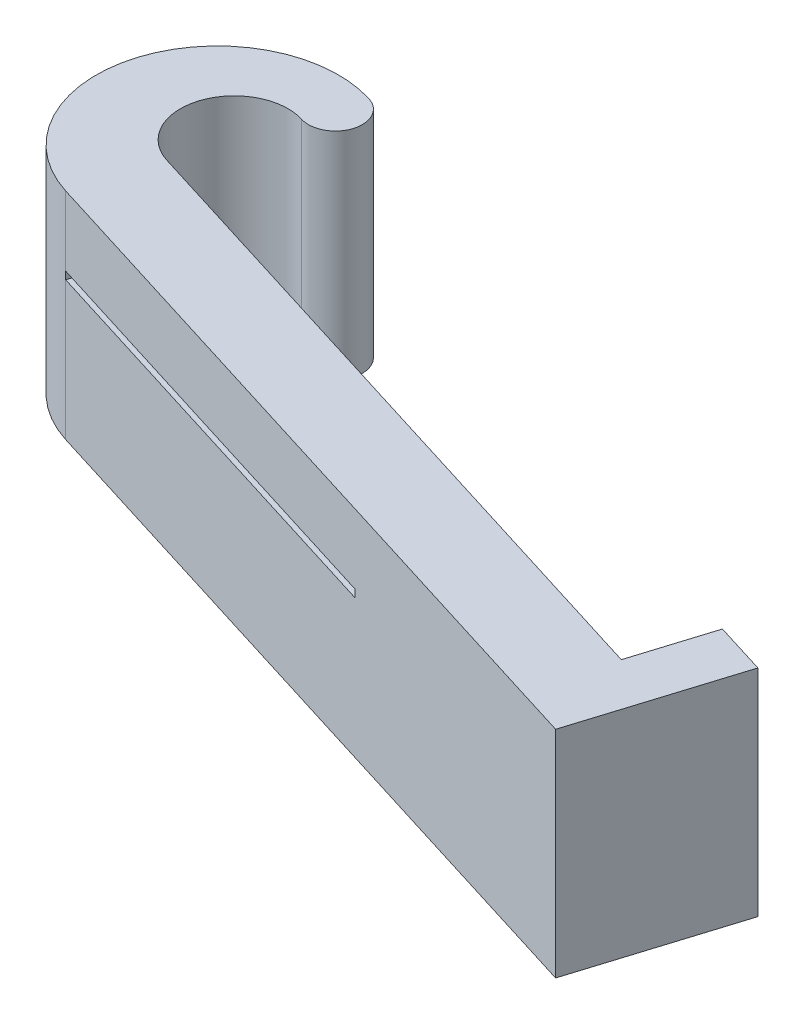
ISO-10303-21;
HEADER;
FILE_DESCRIPTION(('STEP AP214'),'2;1');
FILE_NAME('part.step','',(''),(''),'','','');
FILE_SCHEMA(('AUTOMOTIVE_DESIGN { 1 0 10303 214 1 1 1 1 }'));
ENDSEC;
DATA;
#1=APPLICATION_CONTEXT('core data for automotive mechanical design processes');
#2=APPLICATION_PROTOCOL_DEFINITION('international standard','automotive_design',2000,#1);
#3=PRODUCT_CONTEXT('',#1,'mechanical');
#4=PRODUCT('Part','Part','',(#3));
#5=PRODUCT_RELATED_PRODUCT_CATEGORY('part','',(#4));
#6=PRODUCT_DEFINITION_FORMATION('','',#4);
#7=PRODUCT_DEFINITION_CONTEXT('part definition',#1,'design');
#8=PRODUCT_DEFINITION('design','',#6,#7);
#9=PRODUCT_DEFINITION_SHAPE('','',#8);
#10=(LENGTH_UNIT() NAMED_UNIT(*) SI_UNIT(.MILLI.,.METRE.));
#11=(NAMED_UNIT(*) PLANE_ANGLE_UNIT() SI_UNIT($,.RADIAN.));
#12=(NAMED_UNIT(*) SI_UNIT($,.STERADIAN.) SOLID_ANGLE_UNIT());
#13=UNCERTAINTY_MEASURE_WITH_UNIT(LENGTH_MEASURE(1.E-05),#10,'distance_accuracy_value','');
#14=(GEOMETRIC_REPRESENTATION_CONTEXT(3) GLOBAL_UNCERTAINTY_ASSIGNED_CONTEXT((#13)) GLOBAL_UNIT_ASSIGNED_CONTEXT((#10,
#11,#12)) REPRESENTATION_CONTEXT('',''));
#15=CARTESIAN_POINT('',(0.,0.,0.));
#16=DIRECTION('',(0.,0.,1.));
#17=DIRECTION('',(1.,0.,0.));
#18=AXIS2_PLACEMENT_3D('',#15,#16,#17);
#19=CARTESIAN_POINT('',(-516.187462201425,243.897716301545,44.4627981969084));
#20=DIRECTION('',(-0.954849592597847,0.,-0.297089642222218));
#21=DIRECTION('',(-0.297089642222218,0.,0.954849592597847));
#22=AXIS2_PLACEMENT_3D('',#19,#20,#21);
#23=PLANE('',#22);
#24=DIRECTION('',(0.297089642222218,0.,-0.954849592597847));
#25=VECTOR('',#24,1.);
#26=CARTESIAN_POINT('',(-516.187462201425,17.3432007179993,44.4627981969084));
#27=LINE('',#26,#25);
#28=CARTESIAN_POINT('',(-527.506577570092,17.3432007179993,80.8425676748863));
#29=VERTEX_POINT('',#28);
#30=CARTESIAN_POINT('',(-516.187462201425,17.3432007179993,44.4627981969084));
#31=VERTEX_POINT('',#30);
#32=EDGE_CURVE('E210',#29,#31,#27,.T.);
#33=ORIENTED_EDGE('',*,*,#32,.F.);
#34=DIRECTION('',(0.,-1.,0.));
#35=VECTOR('',#34,1.);
#36=CARTESIAN_POINT('',(-527.506577570092,243.897716301545,80.8425676748863));
#37=LINE('',#36,#35);
#38=CARTESIAN_POINT('',(-527.506577570092,-33.4567992820007,80.8425676748863));
#39=VERTEX_POINT('',#38);
#40=EDGE_CURVE('E39',#29,#39,#37,.T.);
#41=ORIENTED_EDGE('',*,*,#40,.T.);
#42=DIRECTION('',(0.297089642222218,0.,-0.954849592597847));
#43=VECTOR('',#42,1.);
#44=CARTESIAN_POINT('',(-516.187462201425,-33.4567992820007,44.4627981969084));
#45=LINE('',#44,#43);
#46=CARTESIAN_POINT('',(-516.187462201425,-33.4567992820007,44.4627981969084));
#47=VERTEX_POINT('',#46);
#48=EDGE_CURVE('E193',#39,#47,#45,.T.);
#49=ORIENTED_EDGE('',*,*,#48,.T.);
#50=DIRECTION('',(0.,-1.,0.));
#51=VECTOR('',#50,1.);
#52=CARTESIAN_POINT('',(-516.187462201425,243.897716301545,44.4627981969084));
#53=LINE('',#52,#51);
#54=EDGE_CURVE('E192',#31,#47,#53,.T.);
#55=ORIENTED_EDGE('',*,*,#54,.F.);
#56=EDGE_LOOP('',(#33,#41,#49,#55));
#57=FACE_BOUND('',#56,.T.);
#58=ADVANCED_FACE('F35',(#57),#23,.F.);
#59=CARTESIAN_POINT('',(-528.314052027418,243.897716301545,40.6897597406862));
#60=DIRECTION('',(-0.297089642222217,0.,0.954849592597847));
#61=DIRECTION('',(0.954849592597848,0.,0.297089642222217));
#62=AXIS2_PLACEMENT_3D('',#59,#60,#61);
#63=PLANE('',#62);
#64=DIRECTION('',(-0.954849592597848,0.,-0.297089642222217));
#65=VECTOR('',#64,1.);
#66=CARTESIAN_POINT('',(-528.314052027418,17.3432007179993,40.6897597406862));
#67=LINE('',#66,#65);
#68=CARTESIAN_POINT('',(-528.314052027418,17.3432007179993,40.6897597406862));
#69=VERTEX_POINT('',#68);
#70=EDGE_CURVE('E207',#31,#69,#67,.T.);
#71=ORIENTED_EDGE('',*,*,#70,.F.);
#72=ORIENTED_EDGE('',*,*,#54,.T.);
#73=DIRECTION('',(-0.954849592597847,0.,-0.297089642222217));
#74=VECTOR('',#73,1.);
#75=CARTESIAN_POINT('',(-528.314052027418,-33.4567992820007,40.6897597406862));
#76=LINE('',#75,#74);
#77=CARTESIAN_POINT('',(-528.314052027418,-33.4567992820007,40.6897597406862));
#78=VERTEX_POINT('',#77);
#79=EDGE_CURVE('E189',#47,#78,#76,.T.);
#80=ORIENTED_EDGE('',*,*,#79,.T.);
#81=DIRECTION('',(0.,-1.,0.));
#82=VECTOR('',#81,1.);
#83=CARTESIAN_POINT('',(-528.314052027418,243.897716301545,40.6897597406862));
#84=LINE('',#83,#82);
#85=EDGE_CURVE('E188',#69,#78,#84,.T.);
#86=ORIENTED_EDGE('',*,*,#85,.F.);
#87=EDGE_LOOP('',(#71,#72,#80,#86));
#88=FACE_BOUND('',#87,.T.);
#89=ADVANCED_FACE('F254',(#88),#63,.F.);
#90=CARTESIAN_POINT('',(-533.973609711751,243.897716301545,58.8796444796753));
#91=DIRECTION('',(0.95484959259785,0.,0.297089642222211));
#92=DIRECTION('',(0.297089642222211,0.,-0.95484959259785));
#93=AXIS2_PLACEMENT_3D('',#90,#91,#92);
#94=PLANE('',#93);
#95=DIRECTION('',(-0.297089642222211,0.,0.95484959259785));
#96=VECTOR('',#95,1.);
#97=CARTESIAN_POINT('',(-533.973609711751,17.3432007179993,58.8796444796753));
#98=LINE('',#97,#96);
#99=CARTESIAN_POINT('',(-533.973609711751,17.3432007179993,58.8796444796753));
#100=VERTEX_POINT('',#99);
#101=EDGE_CURVE('E204',#69,#100,#98,.T.);
#102=ORIENTED_EDGE('',*,*,#101,.F.);
#103=ORIENTED_EDGE('',*,*,#85,.T.);
#104=DIRECTION('',(-0.297089642222211,0.,0.954849592597849));
#105=VECTOR('',#104,1.);
#106=CARTESIAN_POINT('',(-533.973609711751,-33.4567992820007,58.8796444796753));
#107=LINE('',#106,#105);
#108=CARTESIAN_POINT('',(-533.973609711751,-33.4567992820007,58.8796444796753));
#109=VERTEX_POINT('',#108);
#110=EDGE_CURVE('E185',#78,#109,#107,.T.);
#111=ORIENTED_EDGE('',*,*,#110,.T.);
#112=DIRECTION('',(0.,-1.,0.));
#113=VECTOR('',#112,1.);
#114=CARTESIAN_POINT('',(-533.973609711751,243.897716301545,58.8796444796753));
#115=LINE('',#114,#113);
#116=EDGE_CURVE('E184',#100,#109,#115,.T.);
#117=ORIENTED_EDGE('',*,*,#116,.F.);
#118=EDGE_LOOP('',(#102,#103,#111,#117));
#119=FACE_BOUND('',#118,.T.);
#120=ADVANCED_FACE('F251',(#119),#94,.F.);
#121=CARTESIAN_POINT('',(-689.573038456222,243.897716301545,10.4668065059927));
#122=DIRECTION('',(-0.297089642222218,0.,0.954849592597847));
#123=DIRECTION('',(0.954849592597847,0.,0.297089642222218));
#124=AXIS2_PLACEMENT_3D('',#121,#122,#123);
#125=PLANE('',#124);
#126=DIRECTION('',(-0.954849592597847,0.,-0.297089642222218));
#127=VECTOR('',#126,1.);
#128=CARTESIAN_POINT('',(-689.573038456222,17.3432007179993,10.4668065059927));
#129=LINE('',#128,#127);
#130=CARTESIAN_POINT('',(-689.573038456222,17.3432007179993,10.4668065059927));
#131=VERTEX_POINT('',#130);
#132=EDGE_CURVE('E201',#100,#131,#129,.T.);
#133=ORIENTED_EDGE('',*,*,#132,.F.);
#134=ORIENTED_EDGE('',*,*,#116,.T.);
#135=DIRECTION('',(-0.954849592597847,0.,-0.297089642222218));
#136=VECTOR('',#135,1.);
#137=CARTESIAN_POINT('',(-689.573038456222,-33.4567992820007,10.4668065059927));
#138=LINE('',#137,#136);
#139=CARTESIAN_POINT('',(-689.573038456222,-33.4567992820007,10.4668065059927));
#140=VERTEX_POINT('',#139);
#141=EDGE_CURVE('E181',#109,#140,#138,.T.);
#142=ORIENTED_EDGE('',*,*,#141,.T.);
#143=DIRECTION('',(0.,-1.,0.));
#144=VECTOR('',#143,1.);
#145=CARTESIAN_POINT('',(-689.573038456222,243.897716301545,10.4668065059927));
#146=LINE('',#145,#144);
#147=EDGE_CURVE('E180',#131,#140,#146,.T.);
#148=ORIENTED_EDGE('',*,*,#147,.F.);
#149=EDGE_LOOP('',(#133,#134,#142,#148));
#150=FACE_BOUND('',#149,.T.);
#151=ADVANCED_FACE('F248',(#150),#125,.F.);
#152=CARTESIAN_POINT('',(-685.8,243.897716301545,-1.65978332));
#153=DIRECTION('',(0.,-1.,0.));
#154=DIRECTION('',(0.,0.,-1.));
#155=AXIS2_PLACEMENT_3D('',#152,#153,#154);
#156=CYLINDRICAL_SURFACE('',#155,12.7);
#157=CARTESIAN_POINT('',(-685.8,17.3432007179993,-1.65978332));
#158=DIRECTION('',(0.,1.,0.));
#159=DIRECTION('',(0.,0.,1.));
#160=AXIS2_PLACEMENT_3D('',#157,#158,#159);
#161=CIRCLE('',#160,12.7);
#162=CARTESIAN_POINT('',(-682.026961543778,17.3432007179993,-13.7863731459927));
#163=VERTEX_POINT('',#162);
#164=EDGE_CURVE('E198',#131,#163,#161,.F.);
#165=ORIENTED_EDGE('',*,*,#164,.F.);
#166=ORIENTED_EDGE('',*,*,#147,.T.);
#167=CARTESIAN_POINT('',(-685.8,-33.4567992820007,-1.65978332));
#168=DIRECTION('',(0.,-1.,0.));
#169=DIRECTION('',(0.,0.,-1.));
#170=AXIS2_PLACEMENT_3D('',#167,#168,#169);
#171=CIRCLE('',#170,12.7);
#172=CARTESIAN_POINT('',(-682.026961543778,-33.4567992820007,-13.7863731459927));
#173=VERTEX_POINT('',#172);
#174=EDGE_CURVE('E177',#140,#173,#171,.T.);
#175=ORIENTED_EDGE('',*,*,#174,.T.);
#176=DIRECTION('',(0.,-1.,0.));
#177=VECTOR('',#176,1.);
#178=CARTESIAN_POINT('',(-682.026961543778,243.897716301545,-13.7863731459927));
#179=LINE('',#178,#177);
#180=EDGE_CURVE('E176',#163,#173,#179,.T.);
#181=ORIENTED_EDGE('',*,*,#180,.F.);
#182=EDGE_LOOP('',(#165,#166,#175,#181));
#183=FACE_BOUND('',#182,.T.);
#184=ADVANCED_FACE('F245',(#183),#156,.F.);
#185=CARTESIAN_POINT('',(-680.140442315667,243.897716301545,-19.849668058989));
#186=DIRECTION('',(0.,-1.,0.));
#187=DIRECTION('',(0.,0.,-1.));
#188=AXIS2_PLACEMENT_3D('',#185,#186,#187);
#189=CYLINDRICAL_SURFACE('',#188,6.35);
#190=CARTESIAN_POINT('',(-680.140442315667,17.3432007179993,-19.849668058989));
#191=DIRECTION('',(0.,1.,0.));
#192=DIRECTION('',(0.,0.,1.));
#193=AXIS2_PLACEMENT_3D('',#190,#191,#192);
#194=CIRCLE('',#193,6.35);
#195=CARTESIAN_POINT('',(-678.253923087556,17.3432007179993,-25.9129629719854));
#196=VERTEX_POINT('',#195);
#197=EDGE_CURVE('E44',#163,#196,#194,.T.);
#198=ORIENTED_EDGE('',*,*,#197,.F.);
#199=ORIENTED_EDGE('',*,*,#180,.T.);
#200=CARTESIAN_POINT('',(-680.140442315667,-33.4567992820007,-19.849668058989));
#201=DIRECTION('',(0.,1.,0.));
#202=DIRECTION('',(0.,0.,-1.));
#203=AXIS2_PLACEMENT_3D('',#200,#201,#202);
#204=CIRCLE('',#203,6.35);
#205=CARTESIAN_POINT('',(-678.253923087556,-33.4567992820007,-25.9129629719854));
#206=VERTEX_POINT('',#205);
#207=EDGE_CURVE('E173',#173,#206,#204,.T.);
#208=ORIENTED_EDGE('',*,*,#207,.T.);
#209=DIRECTION('',(0.,-1.,0.));
#210=VECTOR('',#209,1.);
#211=CARTESIAN_POINT('',(-678.253923087556,243.897716301545,-25.9129629719854));
#212=LINE('',#211,#210);
#213=EDGE_CURVE('E172',#196,#206,#212,.T.);
#214=ORIENTED_EDGE('',*,*,#213,.F.);
#215=EDGE_LOOP('',(#198,#199,#208,#214));
#216=FACE_BOUND('',#215,.T.);
#217=ADVANCED_FACE('F240',(#216),#189,.T.);
#218=CARTESIAN_POINT('',(-686.743259614056,243.897716301545,1.37186413649816));
#219=DIRECTION('',(0.,-1.,0.));
#220=DIRECTION('',(0.,0.,-1.));
#221=AXIS2_PLACEMENT_3D('',#218,#219,#220);
#222=CYLINDRICAL_SURFACE('',#221,28.575);
#223=CARTESIAN_POINT('',(-686.743259614056,17.3432007179993,1.37186413649816));
#224=DIRECTION('',(0.,1.,0.));
#225=DIRECTION('',(0.,0.,1.));
#226=AXIS2_PLACEMENT_3D('',#223,#224,#225);
#227=CIRCLE('',#226,28.575);
#228=CARTESIAN_POINT('',(-695.232596140555,17.3432007179993,28.6566912449817));
#229=VERTEX_POINT('',#228);
#230=EDGE_CURVE('E11',#196,#229,#227,.T.);
#231=ORIENTED_EDGE('',*,*,#230,.F.);
#232=ORIENTED_EDGE('',*,*,#213,.T.);
#233=CARTESIAN_POINT('',(-686.743259614056,-33.4567992820007,1.37186413649816));
#234=DIRECTION('',(0.,1.,0.));
#235=DIRECTION('',(0.,0.,-1.));
#236=AXIS2_PLACEMENT_3D('',#233,#234,#235);
#237=CIRCLE('',#236,28.575);
#238=CARTESIAN_POINT('',(-695.232596140555,-33.4567992820007,28.6566912449817));
#239=VERTEX_POINT('',#238);
#240=EDGE_CURVE('E168',#206,#239,#237,.T.);
#241=ORIENTED_EDGE('',*,*,#240,.T.);
#242=DIRECTION('',(0.,-1.,0.));
#243=VECTOR('',#242,1.);
#244=CARTESIAN_POINT('',(-695.232596140555,243.897716301545,28.6566912449817));
#245=LINE('',#244,#243);
#246=CARTESIAN_POINT('',(-695.232596140555,-0.819404421791042,28.6566912449817));
#247=VERTEX_POINT('',#246);
#248=EDGE_CURVE('E171',#247,#239,#245,.T.);
#249=ORIENTED_EDGE('',*,*,#248,.F.);
#250=DIRECTION('',(0.,-1.,0.));
#251=VECTOR('',#250,1.);
#252=CARTESIAN_POINT('',(-695.232596140555,0.961805857789599,28.6566912449818));
#253=LINE('',#252,#251);
#254=CARTESIAN_POINT('',(-695.232596140555,0.961805857789599,28.6566912449818));
#255=VERTEX_POINT('',#254);
#256=EDGE_CURVE('E52',#255,#247,#253,.T.);
#257=ORIENTED_EDGE('',*,*,#256,.F.);
#258=EDGE_CURVE('E167',#229,#255,#245,.T.);
#259=ORIENTED_EDGE('',*,*,#258,.F.);
#260=EDGE_LOOP('',(#231,#232,#241,#249,#257,#259));
#261=FACE_BOUND('',#260,.T.);
#262=ADVANCED_FACE('F229',(#261),#222,.T.);
#263=CARTESIAN_POINT('',(-527.506577570092,243.897716301545,80.8425676748863));
#264=DIRECTION('',(0.297089642222217,0.,-0.954849592597848));
#265=DIRECTION('',(-0.954849592597848,0.,-0.297089642222217));
#266=AXIS2_PLACEMENT_3D('',#263,#264,#265);
#267=PLANE('',#266);
#268=ORIENTED_EDGE('',*,*,#258,.T.);
#269=DIRECTION('',(-0.954849592597847,0.,-0.297089642222217));
#270=VECTOR('',#269,1.);
#271=CARTESIAN_POINT('',(-695.232596140555,0.961805857789599,28.6566912449818));
#272=LINE('',#271,#270);
#273=CARTESIAN_POINT('',(-596.12540192545,0.961805857789599,59.4926690777903));
#274=VERTEX_POINT('',#273);
#275=EDGE_CURVE('E146',#274,#255,#272,.T.);
#276=ORIENTED_EDGE('',*,*,#275,.F.);
#277=DIRECTION('',(0.,1.,0.));
#278=VECTOR('',#277,1.);
#279=CARTESIAN_POINT('',(-596.12540192545,0.961805857789599,59.4926690777903));
#280=LINE('',#279,#278);
#281=CARTESIAN_POINT('',(-596.12540192545,-0.819404421791049,59.4926690777903));
#282=VERTEX_POINT('',#281);
#283=EDGE_CURVE('E149',#282,#274,#280,.T.);
#284=ORIENTED_EDGE('',*,*,#283,.F.);
#285=DIRECTION('',(0.954849592597847,0.,0.297089642222217));
#286=VECTOR('',#285,1.);
#287=CARTESIAN_POINT('',(-695.232596140555,-0.819404421791049,28.6566912449818));
#288=LINE('',#287,#286);
#289=EDGE_CURVE('E155',#247,#282,#288,.T.);
#290=ORIENTED_EDGE('',*,*,#289,.F.);
#291=ORIENTED_EDGE('',*,*,#248,.T.);
#292=DIRECTION('',(0.954849592597847,0.,0.297089642222217));
#293=VECTOR('',#292,1.);
#294=CARTESIAN_POINT('',(-527.506577570092,-33.4567992820007,80.8425676748863));
#295=LINE('',#294,#293);
#296=EDGE_CURVE('E164',#239,#39,#295,.T.);
#297=ORIENTED_EDGE('',*,*,#296,.T.);
#298=ORIENTED_EDGE('',*,*,#40,.F.);
#299=DIRECTION('',(0.954849592597848,0.,0.297089642222217));
#300=VECTOR('',#299,1.);
#301=CARTESIAN_POINT('',(-527.506577570092,17.3432007179993,80.8425676748863));
#302=LINE('',#301,#300);
#303=EDGE_CURVE('E166',#229,#29,#302,.T.);
#304=ORIENTED_EDGE('',*,*,#303,.F.);
#305=EDGE_LOOP('',(#268,#276,#284,#290,#291,#297,#298,#304));
#306=FACE_BOUND('',#305,.T.);
#307=ADVANCED_FACE('F223',(#306),#267,.F.);
#308=CARTESIAN_POINT('',(-686.743259614056,-33.4567992820007,1.37186413649816));
#309=DIRECTION('',(0.,-1.,0.));
#310=DIRECTION('',(0.,0.,-1.));
#311=AXIS2_PLACEMENT_3D('',#308,#309,#310);
#312=PLANE('',#311);
#313=ORIENTED_EDGE('',*,*,#48,.F.);
#314=ORIENTED_EDGE('',*,*,#296,.F.);
#315=ORIENTED_EDGE('',*,*,#240,.F.);
#316=ORIENTED_EDGE('',*,*,#207,.F.);
#317=ORIENTED_EDGE('',*,*,#174,.F.);
#318=ORIENTED_EDGE('',*,*,#141,.F.);
#319=ORIENTED_EDGE('',*,*,#110,.F.);
#320=ORIENTED_EDGE('',*,*,#79,.F.);
#321=EDGE_LOOP('',(#313,#314,#315,#316,#317,#318,#319,#320));
#322=FACE_BOUND('',#321,.T.);
#323=ADVANCED_FACE('F233',(#322),#312,.T.);
#324=CARTESIAN_POINT('',(-438.150016701856,17.3432007179993,160.02));
#325=DIRECTION('',(0.,1.,0.));
#326=DIRECTION('',(0.,0.,1.));
#327=AXIS2_PLACEMENT_3D('',#324,#325,#326);
#328=PLANE('',#327);
#329=ORIENTED_EDGE('',*,*,#303,.T.);
#330=ORIENTED_EDGE('',*,*,#32,.T.);
#331=ORIENTED_EDGE('',*,*,#70,.T.);
#332=ORIENTED_EDGE('',*,*,#101,.T.);
#333=ORIENTED_EDGE('',*,*,#132,.T.);
#334=ORIENTED_EDGE('',*,*,#164,.T.);
#335=ORIENTED_EDGE('',*,*,#197,.T.);
#336=ORIENTED_EDGE('',*,*,#230,.T.);
#337=EDGE_LOOP('',(#329,#330,#331,#332,#333,#334,#335,#336));
#338=FACE_BOUND('',#337,.T.);
#339=ADVANCED_FACE('F37',(#338),#328,.T.);
#340=CARTESIAN_POINT('',(-694.477988449311,0.961805857789599,26.2313732797833));
#341=DIRECTION('',(-0.954849592597847,0.,-0.297089642222217));
#342=DIRECTION('',(-0.297089642222217,0.,0.954849592597848));
#343=AXIS2_PLACEMENT_3D('',#340,#341,#342);
#344=PLANE('',#343);
#345=ORIENTED_EDGE('',*,*,#256,.T.);
#346=DIRECTION('',(-0.297089642222217,0.,0.954849592597847));
#347=VECTOR('',#346,1.);
#348=CARTESIAN_POINT('',(-694.477988449311,-0.819404421791049,26.2313732797833));
#349=LINE('',#348,#347);
#350=CARTESIAN_POINT('',(-694.477988449311,-0.819404421791049,26.2313732797833));
#351=VERTEX_POINT('',#350);
#352=EDGE_CURVE('E124',#351,#247,#349,.T.);
#353=ORIENTED_EDGE('',*,*,#352,.F.);
#354=DIRECTION('',(0.,-1.,0.));
#355=VECTOR('',#354,1.);
#356=CARTESIAN_POINT('',(-694.477988449311,0.961805857789599,26.2313732797833));
#357=LINE('',#356,#355);
#358=CARTESIAN_POINT('',(-694.477988449311,0.961805857789599,26.2313732797833));
#359=VERTEX_POINT('',#358);
#360=EDGE_CURVE('E128',#359,#351,#357,.T.);
#361=ORIENTED_EDGE('',*,*,#360,.F.);
#362=DIRECTION('',(-0.297089642222217,0.,0.954849592597847));
#363=VECTOR('',#362,1.);
#364=CARTESIAN_POINT('',(-694.477988449311,0.961805857789599,26.2313732797833));
#365=LINE('',#364,#363);
#366=EDGE_CURVE('E159',#359,#255,#365,.T.);
#367=ORIENTED_EDGE('',*,*,#366,.T.);
#368=EDGE_LOOP('',(#345,#353,#361,#367));
#369=FACE_BOUND('',#368,.T.);
#370=ADVANCED_FACE('F126',(#369),#344,.F.);
#371=CARTESIAN_POINT('',(-694.477988449311,0.961805857789599,26.2313732797833));
#372=DIRECTION('',(0.,1.,0.));
#373=DIRECTION('',(0.,0.,1.));
#374=AXIS2_PLACEMENT_3D('',#371,#372,#373);
#375=PLANE('',#374);
#376=ORIENTED_EDGE('',*,*,#275,.T.);
#377=ORIENTED_EDGE('',*,*,#366,.F.);
#378=DIRECTION('',(-0.954849592597847,0.,-0.297089642222217));
#379=VECTOR('',#378,1.);
#380=CARTESIAN_POINT('',(-694.477988449311,0.961805857789599,26.2313732797833));
#381=LINE('',#380,#379);
#382=CARTESIAN_POINT('',(-595.370794234206,0.961805857789599,57.0673511125917));
#383=VERTEX_POINT('',#382);
#384=EDGE_CURVE('E134',#383,#359,#381,.T.);
#385=ORIENTED_EDGE('',*,*,#384,.F.);
#386=DIRECTION('',(-0.297089642222217,0.,0.954849592597847));
#387=VECTOR('',#386,1.);
#388=CARTESIAN_POINT('',(-595.370794234206,0.961805857789599,57.0673511125917));
#389=LINE('',#388,#387);
#390=EDGE_CURVE('E161',#383,#274,#389,.T.);
#391=ORIENTED_EDGE('',*,*,#390,.T.);
#392=EDGE_LOOP('',(#376,#377,#385,#391));
#393=FACE_BOUND('',#392,.T.);
#394=ADVANCED_FACE('F277',(#393),#375,.F.);
#395=CARTESIAN_POINT('',(-595.370794234206,0.961805857789599,57.0673511125917));
#396=DIRECTION('',(0.954849592597847,0.,0.297089642222217));
#397=DIRECTION('',(0.297089642222217,0.,-0.954849592597848));
#398=AXIS2_PLACEMENT_3D('',#395,#396,#397);
#399=PLANE('',#398);
#400=ORIENTED_EDGE('',*,*,#283,.T.);
#401=ORIENTED_EDGE('',*,*,#390,.F.);
#402=DIRECTION('',(0.,1.,0.));
#403=VECTOR('',#402,1.);
#404=CARTESIAN_POINT('',(-595.370794234206,0.961805857789599,57.0673511125917));
#405=LINE('',#404,#403);
#406=CARTESIAN_POINT('',(-595.370794234206,-0.819404421791049,57.0673511125917));
#407=VERTEX_POINT('',#406);
#408=EDGE_CURVE('E142',#407,#383,#405,.T.);
#409=ORIENTED_EDGE('',*,*,#408,.F.);
#410=DIRECTION('',(-0.297089642222217,0.,0.954849592597847));
#411=VECTOR('',#410,1.);
#412=CARTESIAN_POINT('',(-595.370794234206,-0.819404421791049,57.0673511125917));
#413=LINE('',#412,#411);
#414=EDGE_CURVE('E133',#407,#282,#413,.T.);
#415=ORIENTED_EDGE('',*,*,#414,.T.);
#416=EDGE_LOOP('',(#400,#401,#409,#415));
#417=FACE_BOUND('',#416,.T.);
#418=ADVANCED_FACE('F280',(#417),#399,.F.);
#419=CARTESIAN_POINT('',(-694.477988449311,-0.819404421791049,26.2313732797833));
#420=DIRECTION('',(0.,-1.,0.));
#421=DIRECTION('',(0.,0.,-1.));
#422=AXIS2_PLACEMENT_3D('',#419,#420,#421);
#423=PLANE('',#422);
#424=ORIENTED_EDGE('',*,*,#289,.T.);
#425=ORIENTED_EDGE('',*,*,#414,.F.);
#426=DIRECTION('',(0.954849592597847,0.,0.297089642222217));
#427=VECTOR('',#426,1.);
#428=CARTESIAN_POINT('',(-694.477988449311,-0.819404421791049,26.2313732797833));
#429=LINE('',#428,#427);
#430=EDGE_CURVE('E137',#351,#407,#429,.T.);
#431=ORIENTED_EDGE('',*,*,#430,.F.);
#432=ORIENTED_EDGE('',*,*,#352,.T.);
#433=EDGE_LOOP('',(#424,#425,#431,#432));
#434=FACE_BOUND('',#433,.T.);
#435=ADVANCED_FACE('F138',(#434),#423,.F.);
#436=CARTESIAN_POINT('',(-68.7374027153185,0.,220.92281806938));
#437=DIRECTION('',(-0.297089642222217,0.,0.954849592597847));
#438=DIRECTION('',(0.954849592597847,0.,0.297089642222217));
#439=AXIS2_PLACEMENT_3D('',#436,#437,#438);
#440=PLANE('',#439);
#441=ORIENTED_EDGE('',*,*,#360,.T.);
#442=ORIENTED_EDGE('',*,*,#430,.T.);
#443=ORIENTED_EDGE('',*,*,#408,.T.);
#444=ORIENTED_EDGE('',*,*,#384,.T.);
#445=EDGE_LOOP('',(#441,#442,#443,#444));
#446=FACE_BOUND('',#445,.T.);
#447=ADVANCED_FACE('F144',(#446),#440,.T.);
#448=CLOSED_SHELL('',(#58,#89,#120,#151,#184,#217,#262,#307,#323,#339,#370,#394,#418,#435,#447));
#449=MANIFOLD_SOLID_BREP('B2',#448);
#450=ADVANCED_BREP_SHAPE_REPRESENTATION('',(#18,#449),#14);
#451=SHAPE_DEFINITION_REPRESENTATION(#9,#450);
ENDSEC;
END-ISO-10303-21;
